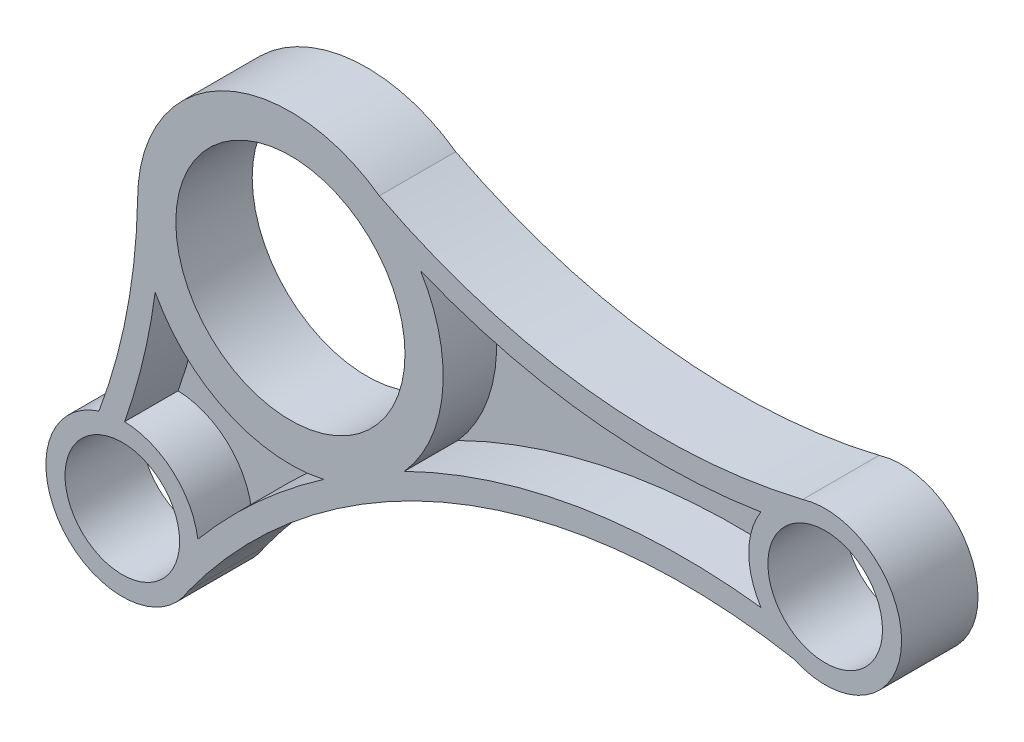
ISO-10303-21;
HEADER;
FILE_DESCRIPTION(('STEP AP214'),'2;1');
FILE_NAME('part.step','',(''),(''),'','','');
FILE_SCHEMA(('AUTOMOTIVE_DESIGN { 1 0 10303 214 1 1 1 1 }'));
ENDSEC;
DATA;
#1=APPLICATION_CONTEXT('core data for automotive mechanical design processes');
#2=APPLICATION_PROTOCOL_DEFINITION('international standard','automotive_design',2000,#1);
#3=PRODUCT_CONTEXT('',#1,'mechanical');
#4=PRODUCT('Part','Part','',(#3));
#5=PRODUCT_RELATED_PRODUCT_CATEGORY('part','',(#4));
#6=PRODUCT_DEFINITION_FORMATION('','',#4);
#7=PRODUCT_DEFINITION_CONTEXT('part definition',#1,'design');
#8=PRODUCT_DEFINITION('design','',#6,#7);
#9=PRODUCT_DEFINITION_SHAPE('','',#8);
#10=(LENGTH_UNIT() NAMED_UNIT(*) SI_UNIT(.MILLI.,.METRE.));
#11=(NAMED_UNIT(*) PLANE_ANGLE_UNIT() SI_UNIT($,.RADIAN.));
#12=(NAMED_UNIT(*) SI_UNIT($,.STERADIAN.) SOLID_ANGLE_UNIT());
#13=UNCERTAINTY_MEASURE_WITH_UNIT(LENGTH_MEASURE(1.E-05),#10,'distance_accuracy_value','');
#14=(GEOMETRIC_REPRESENTATION_CONTEXT(3) GLOBAL_UNCERTAINTY_ASSIGNED_CONTEXT((#13)) GLOBAL_UNIT_ASSIGNED_CONTEXT((#10,
#11,#12)) REPRESENTATION_CONTEXT('',''));
#15=CARTESIAN_POINT('',(0.,0.,0.));
#16=DIRECTION('',(0.,0.,1.));
#17=DIRECTION('',(1.,0.,0.));
#18=AXIS2_PLACEMENT_3D('',#15,#16,#17);
#19=CARTESIAN_POINT('',(158.484836341008,-30.8755712243687,10.));
#20=DIRECTION('',(0.,0.,-1.));
#21=DIRECTION('',(-1.,0.,0.));
#22=AXIS2_PLACEMENT_3D('',#19,#20,#21);
#23=CYLINDRICAL_SURFACE('',#22,83.);
#24=DIRECTION('',(0.,0.,-1.));
#25=VECTOR('',#24,1.);
#26=CARTESIAN_POINT('',(168.540603284391,51.5130296326696,10.));
#27=LINE('',#26,#25);
#28=CARTESIAN_POINT('',(168.540603284391,51.5130296326696,10.));
#29=VERTEX_POINT('',#28);
#30=CARTESIAN_POINT('',(168.540603284391,51.5130296326696,3.));
#31=VERTEX_POINT('',#30);
#32=EDGE_CURVE('E165',#29,#31,#27,.T.);
#33=ORIENTED_EDGE('',*,*,#32,.T.);
#34=CARTESIAN_POINT('',(158.484836341008,-30.8755712243687,3.));
#35=DIRECTION('',(0.,0.,-1.));
#36=DIRECTION('',(1.,0.,0.));
#37=AXIS2_PLACEMENT_3D('',#34,#35,#36);
#38=CIRCLE('',#37,83.);
#39=CARTESIAN_POINT('',(121.860601400403,43.6070805478085,3.));
#40=VERTEX_POINT('',#39);
#41=EDGE_CURVE('E57',#40,#31,#38,.T.);
#42=ORIENTED_EDGE('',*,*,#41,.F.);
#43=DIRECTION('',(0.,0.,-1.));
#44=VECTOR('',#43,1.);
#45=CARTESIAN_POINT('',(121.860601400403,43.6070805478085,10.));
#46=LINE('',#45,#44);
#47=CARTESIAN_POINT('',(121.860601400403,43.6070805478085,10.));
#48=VERTEX_POINT('',#47);
#49=EDGE_CURVE('E11',#48,#40,#46,.T.);
#50=ORIENTED_EDGE('',*,*,#49,.F.);
#51=CARTESIAN_POINT('',(158.484836341008,-30.8755712243687,10.));
#52=DIRECTION('',(0.,0.,1.));
#53=DIRECTION('',(1.,0.,0.));
#54=AXIS2_PLACEMENT_3D('',#51,#52,#53);
#55=CIRCLE('',#54,83.);
#56=EDGE_CURVE('E264',#29,#48,#55,.T.);
#57=ORIENTED_EDGE('',*,*,#56,.F.);
#58=EDGE_LOOP('',(#33,#42,#50,#57));
#59=FACE_BOUND('',#58,.T.);
#60=ADVANCED_FACE('F39',(#59),#23,.T.);
#61=CARTESIAN_POINT('',(106.94543276423,56.9314095948753,10.));
#62=DIRECTION('',(0.,0.,-1.));
#63=DIRECTION('',(-1.,0.,0.));
#64=AXIS2_PLACEMENT_3D('',#61,#62,#63);
#65=CYLINDRICAL_SURFACE('',#64,20.);
#66=ORIENTED_EDGE('',*,*,#49,.T.);
#67=CARTESIAN_POINT('',(106.94543276423,56.9314095948753,3.));
#68=DIRECTION('',(0.,0.,-1.));
#69=DIRECTION('',(1.,0.,0.));
#70=AXIS2_PLACEMENT_3D('',#67,#68,#69);
#71=CIRCLE('',#70,20.);
#72=CARTESIAN_POINT('',(123.981351448656,67.4088842227434,3.));
#73=VERTEX_POINT('',#72);
#74=EDGE_CURVE('E144',#73,#40,#71,.T.);
#75=ORIENTED_EDGE('',*,*,#74,.F.);
#76=DIRECTION('',(0.,0.,-1.));
#77=VECTOR('',#76,1.);
#78=CARTESIAN_POINT('',(123.981351448656,67.4088842227434,10.));
#79=LINE('',#78,#77);
#80=CARTESIAN_POINT('',(123.981351448656,67.4088842227434,10.));
#81=VERTEX_POINT('',#80);
#82=EDGE_CURVE('E49',#81,#73,#79,.T.);
#83=ORIENTED_EDGE('',*,*,#82,.F.);
#84=CARTESIAN_POINT('',(106.94543276423,56.9314095948753,10.));
#85=DIRECTION('',(0.,0.,1.));
#86=DIRECTION('',(1.,0.,0.));
#87=AXIS2_PLACEMENT_3D('',#84,#85,#86);
#88=CIRCLE('',#87,20.);
#89=EDGE_CURVE('E287',#48,#81,#88,.T.);
#90=ORIENTED_EDGE('',*,*,#89,.F.);
#91=EDGE_LOOP('',(#66,#75,#83,#90));
#92=FACE_BOUND('',#91,.T.);
#93=ADVANCED_FACE('F153',(#92),#65,.T.);
#94=CARTESIAN_POINT('',(155.302498185814,144.272307039252,10.));
#95=DIRECTION('',(0.,0.,-1.));
#96=DIRECTION('',(-1.,0.,0.));
#97=AXIS2_PLACEMENT_3D('',#94,#95,#96);
#98=CYLINDRICAL_SURFACE('',#97,83.);
#99=CARTESIAN_POINT('',(155.302498185814,144.272307039252,3.));
#100=DIRECTION('',(0.,0.,-1.));
#101=DIRECTION('',(1.,0.,0.));
#102=AXIS2_PLACEMENT_3D('',#99,#100,#101);
#103=CIRCLE('',#102,83.);
#104=CARTESIAN_POINT('',(168.529854033662,62.3330792098759,3.));
#105=VERTEX_POINT('',#104);
#106=EDGE_CURVE('E141',#105,#73,#103,.T.);
#107=ORIENTED_EDGE('',*,*,#106,.F.);
#108=DIRECTION('',(0.,0.,-1.));
#109=VECTOR('',#108,1.);
#110=CARTESIAN_POINT('',(168.529854033662,62.3330792098759,10.));
#111=LINE('',#110,#109);
#112=CARTESIAN_POINT('',(168.529854033662,62.3330792098759,10.));
#113=VERTEX_POINT('',#112);
#114=EDGE_CURVE('E162',#113,#105,#111,.T.);
#115=ORIENTED_EDGE('',*,*,#114,.F.);
#116=CARTESIAN_POINT('',(155.302498185814,144.272307039252,10.));
#117=DIRECTION('',(0.,0.,1.));
#118=DIRECTION('',(1.,0.,0.));
#119=AXIS2_PLACEMENT_3D('',#116,#117,#118);
#120=CIRCLE('',#119,83.);
#121=EDGE_CURVE('E160',#113,#81,#120,.F.);
#122=ORIENTED_EDGE('',*,*,#121,.T.);
#123=ORIENTED_EDGE('',*,*,#82,.T.);
#124=EDGE_LOOP('',(#107,#115,#122,#123));
#125=FACE_BOUND('',#124,.T.);
#126=ADVANCED_FACE('F158',(#125),#98,.T.);
#127=CARTESIAN_POINT('',(6.96072248214696,58.4954176163667,10.));
#128=DIRECTION('',(0.,0.,-1.));
#129=DIRECTION('',(-1.,0.,0.));
#130=AXIS2_PLACEMENT_3D('',#127,#128,#129);
#131=CYLINDRICAL_SURFACE('',#130,83.);
#132=CARTESIAN_POINT('',(6.96072248214696,58.4954176163667,3.));
#133=DIRECTION('',(0.,0.,-1.));
#134=DIRECTION('',(1.,0.,0.));
#135=AXIS2_PLACEMENT_3D('',#132,#133,#134);
#136=CIRCLE('',#135,83.);
#137=CARTESIAN_POINT('',(89.2451550237641,47.6201171007917,3.));
#138=VERTEX_POINT('',#137);
#139=CARTESIAN_POINT('',(85.2484753494684,30.9268167997636,3.));
#140=VERTEX_POINT('',#139);
#141=EDGE_CURVE('E65',#138,#140,#136,.T.);
#142=ORIENTED_EDGE('',*,*,#141,.F.);
#143=DIRECTION('',(0.,0.,-1.));
#144=VECTOR('',#143,1.);
#145=CARTESIAN_POINT('',(89.2451550237641,47.6201171007917,10.));
#146=LINE('',#145,#144);
#147=CARTESIAN_POINT('',(89.2451550237641,47.6201171007917,10.));
#148=VERTEX_POINT('',#147);
#149=EDGE_CURVE('E181',#148,#138,#146,.T.);
#150=ORIENTED_EDGE('',*,*,#149,.F.);
#151=CARTESIAN_POINT('',(6.96072248214696,58.4954176163667,10.));
#152=DIRECTION('',(0.,0.,1.));
#153=DIRECTION('',(1.,0.,0.));
#154=AXIS2_PLACEMENT_3D('',#151,#152,#153);
#155=CIRCLE('',#154,83.);
#156=CARTESIAN_POINT('',(85.2484753494684,30.9268167997636,10.));
#157=VERTEX_POINT('',#156);
#158=EDGE_CURVE('E302',#148,#157,#155,.F.);
#159=ORIENTED_EDGE('',*,*,#158,.T.);
#160=DIRECTION('',(0.,0.,-1.));
#161=VECTOR('',#160,1.);
#162=CARTESIAN_POINT('',(85.2484753494684,30.9268167997636,10.));
#163=LINE('',#162,#161);
#164=EDGE_CURVE('E169',#157,#140,#163,.T.);
#165=ORIENTED_EDGE('',*,*,#164,.T.);
#166=EDGE_LOOP('',(#142,#150,#159,#165));
#167=FACE_BOUND('',#166,.T.);
#168=ADVANCED_FACE('F362',(#167),#131,.T.);
#169=ORIENTED_EDGE('',*,*,#149,.T.);
#170=CARTESIAN_POINT('',(106.94543276423,56.9314095948753,3.));
#171=DIRECTION('',(0.,0.,-1.));
#172=DIRECTION('',(1.,0.,0.));
#173=AXIS2_PLACEMENT_3D('',#170,#171,#172);
#174=CIRCLE('',#173,20.);
#175=CARTESIAN_POINT('',(111.307748037173,37.41295152413,3.));
#176=VERTEX_POINT('',#175);
#177=EDGE_CURVE('E274',#176,#138,#174,.T.);
#178=ORIENTED_EDGE('',*,*,#177,.F.);
#179=DIRECTION('',(0.,0.,-1.));
#180=VECTOR('',#179,1.);
#181=CARTESIAN_POINT('',(111.307748037173,37.41295152413,10.));
#182=LINE('',#181,#180);
#183=CARTESIAN_POINT('',(111.307748037173,37.41295152413,10.));
#184=VERTEX_POINT('',#183);
#185=EDGE_CURVE('E177',#184,#176,#182,.T.);
#186=ORIENTED_EDGE('',*,*,#185,.F.);
#187=EDGE_CURVE('E288',#148,#184,#88,.T.);
#188=ORIENTED_EDGE('',*,*,#187,.F.);
#189=EDGE_LOOP('',(#169,#178,#186,#188));
#190=FACE_BOUND('',#189,.T.);
#191=ADVANCED_FACE('F350',(#190),#65,.T.);
#192=CARTESIAN_POINT('',(158.484836341008,-30.8755712243687,10.));
#193=DIRECTION('',(0.,0.,-1.));
#194=DIRECTION('',(-1.,0.,0.));
#195=AXIS2_PLACEMENT_3D('',#192,#193,#194);
#196=CYLINDRICAL_SURFACE('',#195,83.);
#197=ORIENTED_EDGE('',*,*,#185,.T.);
#198=CARTESIAN_POINT('',(158.484836341008,-30.8755712243687,3.));
#199=DIRECTION('',(0.,0.,-1.));
#200=DIRECTION('',(1.,0.,0.));
#201=AXIS2_PLACEMENT_3D('',#198,#199,#200);
#202=CIRCLE('',#201,83.);
#203=CARTESIAN_POINT('',(94.8374004670264,22.3973478496549,3.));
#204=VERTEX_POINT('',#203);
#205=EDGE_CURVE('E270',#204,#176,#202,.T.);
#206=ORIENTED_EDGE('',*,*,#205,.F.);
#207=DIRECTION('',(0.,0.,-1.));
#208=VECTOR('',#207,1.);
#209=CARTESIAN_POINT('',(94.8374004670264,22.3973478496549,10.));
#210=LINE('',#209,#208);
#211=CARTESIAN_POINT('',(94.8374004670264,22.3973478496549,10.));
#212=VERTEX_POINT('',#211);
#213=EDGE_CURVE('E173',#212,#204,#210,.T.);
#214=ORIENTED_EDGE('',*,*,#213,.F.);
#215=CARTESIAN_POINT('',(158.484836341008,-30.8755712243687,10.));
#216=DIRECTION('',(0.,0.,1.));
#217=DIRECTION('',(1.,0.,0.));
#218=AXIS2_PLACEMENT_3D('',#215,#216,#217);
#219=CIRCLE('',#218,83.);
#220=EDGE_CURVE('E306',#184,#212,#219,.T.);
#221=ORIENTED_EDGE('',*,*,#220,.F.);
#222=EDGE_LOOP('',(#197,#206,#214,#221));
#223=FACE_BOUND('',#222,.T.);
#224=ADVANCED_FACE('F358',(#223),#196,.T.);
#225=CARTESIAN_POINT('',(155.302498185814,144.272307039252,10.));
#226=DIRECTION('',(0.,0.,-1.));
#227=DIRECTION('',(-1.,0.,0.));
#228=AXIS2_PLACEMENT_3D('',#225,#226,#227);
#229=CYLINDRICAL_SURFACE('',#228,80.);
#230=CARTESIAN_POINT('',(155.302498185814,144.272307039252,0.));
#231=DIRECTION('',(0.,0.,1.));
#232=DIRECTION('',(1.,0.,0.));
#233=AXIS2_PLACEMENT_3D('',#230,#231,#232);
#234=CIRCLE('',#233,80.);
#235=CARTESIAN_POINT('',(174.00261283796,66.4885959424125,0.));
#236=VERTEX_POINT('',#235);
#237=CARTESIAN_POINT('',(118.581891774733,73.1977190010337,0.));
#238=VERTEX_POINT('',#237);
#239=EDGE_CURVE('E218',#236,#238,#234,.F.);
#240=ORIENTED_EDGE('',*,*,#239,.T.);
#241=DIRECTION('',(0.,0.,-1.));
#242=VECTOR('',#241,1.);
#243=CARTESIAN_POINT('',(118.581891774733,73.1977190010337,10.));
#244=LINE('',#243,#242);
#245=CARTESIAN_POINT('',(118.581891774733,73.1977190010337,10.));
#246=VERTEX_POINT('',#245);
#247=EDGE_CURVE('E43',#246,#238,#244,.T.);
#248=ORIENTED_EDGE('',*,*,#247,.F.);
#249=CARTESIAN_POINT('',(155.302498185814,144.272307039252,10.));
#250=DIRECTION('',(0.,0.,1.));
#251=DIRECTION('',(1.,0.,0.));
#252=AXIS2_PLACEMENT_3D('',#249,#250,#251);
#253=CIRCLE('',#252,80.);
#254=CARTESIAN_POINT('',(174.00261283796,66.4885959424125,10.));
#255=VERTEX_POINT('',#254);
#256=EDGE_CURVE('E257',#255,#246,#253,.F.);
#257=ORIENTED_EDGE('',*,*,#256,.F.);
#258=DIRECTION('',(0.,0.,-1.));
#259=VECTOR('',#258,1.);
#260=CARTESIAN_POINT('',(174.00261283796,66.4885959424125,10.));
#261=LINE('',#260,#259);
#262=EDGE_CURVE('E185',#255,#236,#261,.T.);
#263=ORIENTED_EDGE('',*,*,#262,.T.);
#264=EDGE_LOOP('',(#240,#248,#257,#263));
#265=FACE_BOUND('',#264,.T.);
#266=ADVANCED_FACE('F41',(#265),#229,.F.);
#267=CARTESIAN_POINT('',(106.94543276423,56.9314095948753,0.));
#268=DIRECTION('',(0.,0.,1.));
#269=DIRECTION('',(1.,0.,0.));
#270=AXIS2_PLACEMENT_3D('',#267,#268,#269);
#271=CIRCLE('',#270,20.);
#272=CARTESIAN_POINT('',(86.9454327642297,56.9314095948753,0.));
#273=VERTEX_POINT('',#272);
#274=EDGE_CURVE('E212',#238,#273,#271,.T.);
#275=ORIENTED_EDGE('',*,*,#274,.T.);
#276=DIRECTION('',(0.,0.,-1.));
#277=VECTOR('',#276,1.);
#278=CARTESIAN_POINT('',(86.9454327642297,56.9314095948753,10.));
#279=LINE('',#278,#277);
#280=CARTESIAN_POINT('',(86.9454327642297,56.9314095948753,10.));
#281=VERTEX_POINT('',#280);
#282=EDGE_CURVE('E199',#281,#273,#279,.T.);
#283=ORIENTED_EDGE('',*,*,#282,.F.);
#284=EDGE_CURVE('E213',#246,#281,#88,.T.);
#285=ORIENTED_EDGE('',*,*,#284,.F.);
#286=ORIENTED_EDGE('',*,*,#247,.T.);
#287=EDGE_LOOP('',(#275,#283,#285,#286));
#288=FACE_BOUND('',#287,.T.);
#289=ADVANCED_FACE('F211',(#288),#65,.T.);
#290=CARTESIAN_POINT('',(6.96072248214696,58.4954176163667,10.));
#291=DIRECTION('',(0.,0.,-1.));
#292=DIRECTION('',(-1.,0.,0.));
#293=AXIS2_PLACEMENT_3D('',#290,#291,#292);
#294=CYLINDRICAL_SURFACE('',#293,80.);
#295=CARTESIAN_POINT('',(6.96072248214696,58.4954176163667,0.));
#296=DIRECTION('',(0.,0.,1.));
#297=DIRECTION('',(1.,0.,0.));
#298=AXIS2_PLACEMENT_3D('',#295,#296,#297);
#299=CIRCLE('',#298,80.);
#300=CARTESIAN_POINT('',(81.8842119593921,30.4513322407811,0.));
#301=VERTEX_POINT('',#300);
#302=EDGE_CURVE('E227',#273,#301,#299,.F.);
#303=ORIENTED_EDGE('',*,*,#302,.T.);
#304=DIRECTION('',(0.,0.,-1.));
#305=VECTOR('',#304,1.);
#306=CARTESIAN_POINT('',(81.8842119593921,30.4513322407811,10.));
#307=LINE('',#306,#305);
#308=CARTESIAN_POINT('',(81.8842119593921,30.4513322407811,10.));
#309=VERTEX_POINT('',#308);
#310=EDGE_CURVE('E196',#309,#301,#307,.T.);
#311=ORIENTED_EDGE('',*,*,#310,.F.);
#312=CARTESIAN_POINT('',(6.96072248214696,58.4954176163667,10.));
#313=DIRECTION('',(0.,0.,1.));
#314=DIRECTION('',(1.,0.,0.));
#315=AXIS2_PLACEMENT_3D('',#312,#313,#314);
#316=CIRCLE('',#315,80.);
#317=EDGE_CURVE('E286',#281,#309,#316,.F.);
#318=ORIENTED_EDGE('',*,*,#317,.F.);
#319=ORIENTED_EDGE('',*,*,#282,.T.);
#320=EDGE_LOOP('',(#303,#311,#318,#319));
#321=FACE_BOUND('',#320,.T.);
#322=ADVANCED_FACE('F370',(#321),#294,.F.);
#323=CARTESIAN_POINT('',(84.9454327642297,20.9314095948753,10.));
#324=DIRECTION('',(0.,0.,-1.));
#325=DIRECTION('',(-1.,0.,0.));
#326=AXIS2_PLACEMENT_3D('',#323,#324,#325);
#327=CYLINDRICAL_SURFACE('',#326,9.99999999999999);
#328=CARTESIAN_POINT('',(84.9454327642297,20.9314095948753,0.));
#329=DIRECTION('',(0.,0.,1.));
#330=DIRECTION('',(1.,0.,0.));
#331=AXIS2_PLACEMENT_3D('',#328,#329,#330);
#332=CIRCLE('',#331,9.99999999999999);
#333=CARTESIAN_POINT('',(93.5995402638733,15.920778558308,0.));
#334=VERTEX_POINT('',#333);
#335=EDGE_CURVE('E235',#301,#334,#332,.T.);
#336=ORIENTED_EDGE('',*,*,#335,.T.);
#337=DIRECTION('',(0.,0.,-1.));
#338=VECTOR('',#337,1.);
#339=CARTESIAN_POINT('',(93.5995402638733,15.920778558308,10.));
#340=LINE('',#339,#338);
#341=CARTESIAN_POINT('',(93.5995402638733,15.920778558308,10.));
#342=VERTEX_POINT('',#341);
#343=EDGE_CURVE('E193',#342,#334,#340,.T.);
#344=ORIENTED_EDGE('',*,*,#343,.F.);
#345=CARTESIAN_POINT('',(84.9454327642297,20.9314095948753,10.));
#346=DIRECTION('',(0.,0.,1.));
#347=DIRECTION('',(1.,0.,0.));
#348=AXIS2_PLACEMENT_3D('',#345,#346,#347);
#349=CIRCLE('',#348,9.99999999999999);
#350=EDGE_CURVE('E291',#309,#342,#349,.T.);
#351=ORIENTED_EDGE('',*,*,#350,.F.);
#352=ORIENTED_EDGE('',*,*,#310,.T.);
#353=EDGE_LOOP('',(#336,#344,#351,#352));
#354=FACE_BOUND('',#353,.T.);
#355=ADVANCED_FACE('F357',(#354),#327,.T.);
#356=CARTESIAN_POINT('',(158.484836341008,-30.8755712243687,10.));
#357=DIRECTION('',(0.,0.,-1.));
#358=DIRECTION('',(-1.,0.,0.));
#359=AXIS2_PLACEMENT_3D('',#356,#357,#358);
#360=CYLINDRICAL_SURFACE('',#359,80.);
#361=CARTESIAN_POINT('',(158.484836341008,-30.8755712243687,0.));
#362=DIRECTION('',(0.,0.,1.));
#363=DIRECTION('',(1.,0.,0.));
#364=AXIS2_PLACEMENT_3D('',#361,#362,#363);
#365=CIRCLE('',#364,80.);
#366=CARTESIAN_POINT('',(172.792265806554,47.8346407057768,0.));
#367=VERTEX_POINT('',#366);
#368=EDGE_CURVE('E239',#367,#334,#365,.T.);
#369=ORIENTED_EDGE('',*,*,#368,.F.);
#370=DIRECTION('',(0.,0.,-1.));
#371=VECTOR('',#370,1.);
#372=CARTESIAN_POINT('',(172.792265806554,47.8346407057768,10.));
#373=LINE('',#372,#371);
#374=CARTESIAN_POINT('',(172.792265806554,47.8346407057768,10.));
#375=VERTEX_POINT('',#374);
#376=EDGE_CURVE('E189',#375,#367,#373,.T.);
#377=ORIENTED_EDGE('',*,*,#376,.F.);
#378=CARTESIAN_POINT('',(158.484836341008,-30.8755712243687,10.));
#379=DIRECTION('',(0.,0.,1.));
#380=DIRECTION('',(1.,0.,0.));
#381=AXIS2_PLACEMENT_3D('',#378,#379,#380);
#382=CIRCLE('',#381,80.);
#383=EDGE_CURVE('E294',#375,#342,#382,.T.);
#384=ORIENTED_EDGE('',*,*,#383,.T.);
#385=ORIENTED_EDGE('',*,*,#343,.T.);
#386=EDGE_LOOP('',(#369,#377,#384,#385));
#387=FACE_BOUND('',#386,.T.);
#388=ADVANCED_FACE('F366',(#387),#360,.F.);
#389=CARTESIAN_POINT('',(84.9454327642297,20.9314095948753,10.));
#390=DIRECTION('',(0.,0.,-1.));
#391=DIRECTION('',(-1.,0.,0.));
#392=AXIS2_PLACEMENT_3D('',#389,#390,#391);
#393=CYLINDRICAL_SURFACE('',#392,7.50000000000001);
#394=CARTESIAN_POINT('',(84.9454327642297,20.9314095948753,10.));
#395=DIRECTION('',(0.,0.,1.));
#396=DIRECTION('',(1.,0.,0.));
#397=AXIS2_PLACEMENT_3D('',#394,#395,#396);
#398=CIRCLE('',#397,7.50000000000001);
#399=CARTESIAN_POINT('',(92.4454327642297,20.9314095948753,10.));
#400=VERTEX_POINT('',#399);
#401=EDGE_CURVE('E317',#400,#400,#398,.T.);
#402=ORIENTED_EDGE('',*,*,#401,.T.);
#403=EDGE_LOOP('',(#402));
#404=FACE_BOUND('',#403,.T.);
#405=CARTESIAN_POINT('',(84.9454327642297,20.9314095948753,0.));
#406=DIRECTION('',(0.,0.,1.));
#407=DIRECTION('',(1.,0.,0.));
#408=AXIS2_PLACEMENT_3D('',#405,#406,#407);
#409=CIRCLE('',#408,7.50000000000001);
#410=CARTESIAN_POINT('',(92.4454327642297,20.9314095948753,0.));
#411=VERTEX_POINT('',#410);
#412=EDGE_CURVE('E250',#411,#411,#409,.T.);
#413=ORIENTED_EDGE('',*,*,#412,.F.);
#414=EDGE_LOOP('',(#413));
#415=FACE_BOUND('',#414,.T.);
#416=ADVANCED_FACE('F368',(#404,#415),#393,.F.);
#417=CARTESIAN_POINT('',(176.94543276423,56.9314095948753,10.));
#418=DIRECTION('',(0.,0.,-1.));
#419=DIRECTION('',(-1.,0.,0.));
#420=AXIS2_PLACEMENT_3D('',#417,#418,#419);
#421=CYLINDRICAL_SURFACE('',#420,7.50000000000001);
#422=CARTESIAN_POINT('',(176.94543276423,56.9314095948753,10.));
#423=DIRECTION('',(0.,0.,1.));
#424=DIRECTION('',(1.,0.,0.));
#425=AXIS2_PLACEMENT_3D('',#422,#423,#424);
#426=CIRCLE('',#425,7.50000000000001);
#427=CARTESIAN_POINT('',(184.44543276423,56.9314095948753,10.));
#428=VERTEX_POINT('',#427);
#429=EDGE_CURVE('E314',#428,#428,#426,.T.);
#430=ORIENTED_EDGE('',*,*,#429,.T.);
#431=EDGE_LOOP('',(#430));
#432=FACE_BOUND('',#431,.T.);
#433=CARTESIAN_POINT('',(176.94543276423,56.9314095948753,0.));
#434=DIRECTION('',(0.,0.,1.));
#435=DIRECTION('',(1.,0.,0.));
#436=AXIS2_PLACEMENT_3D('',#433,#434,#435);
#437=CIRCLE('',#436,7.50000000000001);
#438=CARTESIAN_POINT('',(184.44543276423,56.9314095948753,0.));
#439=VERTEX_POINT('',#438);
#440=EDGE_CURVE('E246',#439,#439,#437,.T.);
#441=ORIENTED_EDGE('',*,*,#440,.F.);
#442=EDGE_LOOP('',(#441));
#443=FACE_BOUND('',#442,.T.);
#444=ADVANCED_FACE('F392',(#432,#443),#421,.F.);
#445=CARTESIAN_POINT('',(176.94543276423,56.9314095948753,10.));
#446=DIRECTION('',(0.,0.,-1.));
#447=DIRECTION('',(-1.,0.,0.));
#448=AXIS2_PLACEMENT_3D('',#445,#446,#447);
#449=CYLINDRICAL_SURFACE('',#448,10.);
#450=ORIENTED_EDGE('',*,*,#114,.T.);
#451=CARTESIAN_POINT('',(176.94543276423,56.9314095948753,3.));
#452=DIRECTION('',(0.,0.,-1.));
#453=DIRECTION('',(1.,0.,0.));
#454=AXIS2_PLACEMENT_3D('',#451,#452,#453);
#455=CIRCLE('',#454,10.);
#456=EDGE_CURVE('E145',#31,#105,#455,.T.);
#457=ORIENTED_EDGE('',*,*,#456,.F.);
#458=ORIENTED_EDGE('',*,*,#32,.F.);
#459=CARTESIAN_POINT('',(176.94543276423,56.9314095948753,10.));
#460=DIRECTION('',(0.,0.,1.));
#461=DIRECTION('',(1.,0.,0.));
#462=AXIS2_PLACEMENT_3D('',#459,#460,#461);
#463=CIRCLE('',#462,10.);
#464=EDGE_CURVE('E268',#113,#29,#463,.T.);
#465=ORIENTED_EDGE('',*,*,#464,.F.);
#466=EDGE_LOOP('',(#450,#457,#458,#465));
#467=FACE_BOUND('',#466,.T.);
#468=ADVANCED_FACE('F267',(#467),#449,.T.);
#469=ORIENTED_EDGE('',*,*,#213,.T.);
#470=CARTESIAN_POINT('',(84.9454327642297,20.9314095948753,3.));
#471=DIRECTION('',(0.,0.,-1.));
#472=DIRECTION('',(1.,0.,0.));
#473=AXIS2_PLACEMENT_3D('',#470,#471,#472);
#474=CIRCLE('',#473,9.99999999999999);
#475=EDGE_CURVE('E223',#140,#204,#474,.T.);
#476=ORIENTED_EDGE('',*,*,#475,.F.);
#477=ORIENTED_EDGE('',*,*,#164,.F.);
#478=EDGE_CURVE('E295',#212,#157,#349,.T.);
#479=ORIENTED_EDGE('',*,*,#478,.F.);
#480=EDGE_LOOP('',(#469,#476,#477,#479));
#481=FACE_BOUND('',#480,.T.);
#482=ADVANCED_FACE('F353',(#481),#327,.T.);
#483=CARTESIAN_POINT('',(176.94543276423,56.9314095948753,0.));
#484=DIRECTION('',(0.,0.,1.));
#485=DIRECTION('',(1.,0.,0.));
#486=AXIS2_PLACEMENT_3D('',#483,#484,#485);
#487=CIRCLE('',#486,10.);
#488=EDGE_CURVE('E243',#367,#236,#487,.T.);
#489=ORIENTED_EDGE('',*,*,#488,.T.);
#490=ORIENTED_EDGE('',*,*,#262,.F.);
#491=EDGE_CURVE('E299',#375,#255,#463,.T.);
#492=ORIENTED_EDGE('',*,*,#491,.F.);
#493=ORIENTED_EDGE('',*,*,#376,.T.);
#494=EDGE_LOOP('',(#489,#490,#492,#493));
#495=FACE_BOUND('',#494,.T.);
#496=ADVANCED_FACE('F340',(#495),#449,.T.);
#497=CARTESIAN_POINT('',(106.94543276423,56.9314095948753,10.));
#498=DIRECTION('',(0.,0.,-1.));
#499=DIRECTION('',(-1.,0.,0.));
#500=AXIS2_PLACEMENT_3D('',#497,#498,#499);
#501=CYLINDRICAL_SURFACE('',#500,15.);
#502=CARTESIAN_POINT('',(106.94543276423,56.9314095948753,10.));
#503=DIRECTION('',(0.,0.,1.));
#504=DIRECTION('',(1.,0.,0.));
#505=AXIS2_PLACEMENT_3D('',#502,#503,#504);
#506=CIRCLE('',#505,15.);
#507=CARTESIAN_POINT('',(121.94543276423,56.9314095948753,10.));
#508=VERTEX_POINT('',#507);
#509=EDGE_CURVE('E190',#508,#508,#506,.T.);
#510=ORIENTED_EDGE('',*,*,#509,.T.);
#511=EDGE_LOOP('',(#510));
#512=FACE_BOUND('',#511,.T.);
#513=CARTESIAN_POINT('',(106.94543276423,56.9314095948753,0.));
#514=DIRECTION('',(0.,0.,1.));
#515=DIRECTION('',(1.,0.,0.));
#516=AXIS2_PLACEMENT_3D('',#513,#514,#515);
#517=CIRCLE('',#516,15.);
#518=CARTESIAN_POINT('',(121.94543276423,56.9314095948753,0.));
#519=VERTEX_POINT('',#518);
#520=EDGE_CURVE('E254',#519,#519,#517,.T.);
#521=ORIENTED_EDGE('',*,*,#520,.F.);
#522=EDGE_LOOP('',(#521));
#523=FACE_BOUND('',#522,.T.);
#524=ADVANCED_FACE('F326',(#512,#523),#501,.F.);
#525=CARTESIAN_POINT('',(0.,0.,10.));
#526=DIRECTION('',(0.,0.,1.));
#527=DIRECTION('',(1.,0.,0.));
#528=AXIS2_PLACEMENT_3D('',#525,#526,#527);
#529=PLANE('',#528);
#530=ORIENTED_EDGE('',*,*,#256,.T.);
#531=ORIENTED_EDGE('',*,*,#284,.T.);
#532=ORIENTED_EDGE('',*,*,#317,.T.);
#533=ORIENTED_EDGE('',*,*,#350,.T.);
#534=ORIENTED_EDGE('',*,*,#383,.F.);
#535=ORIENTED_EDGE('',*,*,#491,.T.);
#536=EDGE_LOOP('',(#530,#531,#532,#533,#534,#535));
#537=FACE_BOUND('',#536,.T.);
#538=ORIENTED_EDGE('',*,*,#158,.F.);
#539=ORIENTED_EDGE('',*,*,#187,.T.);
#540=ORIENTED_EDGE('',*,*,#220,.T.);
#541=ORIENTED_EDGE('',*,*,#478,.T.);
#542=EDGE_LOOP('',(#538,#539,#540,#541));
#543=FACE_BOUND('',#542,.T.);
#544=ORIENTED_EDGE('',*,*,#56,.T.);
#545=ORIENTED_EDGE('',*,*,#89,.T.);
#546=ORIENTED_EDGE('',*,*,#121,.F.);
#547=ORIENTED_EDGE('',*,*,#464,.T.);
#548=EDGE_LOOP('',(#544,#545,#546,#547));
#549=FACE_BOUND('',#548,.T.);
#550=ORIENTED_EDGE('',*,*,#429,.F.);
#551=EDGE_LOOP('',(#550));
#552=FACE_BOUND('',#551,.T.);
#553=ORIENTED_EDGE('',*,*,#401,.F.);
#554=EDGE_LOOP('',(#553));
#555=FACE_BOUND('',#554,.T.);
#556=ORIENTED_EDGE('',*,*,#509,.F.);
#557=EDGE_LOOP('',(#556));
#558=FACE_BOUND('',#557,.T.);
#559=ADVANCED_FACE('F329',(#537,#543,#549,#552,#555,#558),#529,.T.);
#560=CARTESIAN_POINT('',(0.,0.,0.));
#561=DIRECTION('',(0.,0.,1.));
#562=DIRECTION('',(1.,0.,0.));
#563=AXIS2_PLACEMENT_3D('',#560,#561,#562);
#564=PLANE('',#563);
#565=ORIENTED_EDGE('',*,*,#239,.F.);
#566=ORIENTED_EDGE('',*,*,#488,.F.);
#567=ORIENTED_EDGE('',*,*,#368,.T.);
#568=ORIENTED_EDGE('',*,*,#335,.F.);
#569=ORIENTED_EDGE('',*,*,#302,.F.);
#570=ORIENTED_EDGE('',*,*,#274,.F.);
#571=EDGE_LOOP('',(#565,#566,#567,#568,#569,#570));
#572=FACE_BOUND('',#571,.T.);
#573=ORIENTED_EDGE('',*,*,#440,.T.);
#574=EDGE_LOOP('',(#573));
#575=FACE_BOUND('',#574,.T.);
#576=ORIENTED_EDGE('',*,*,#412,.T.);
#577=EDGE_LOOP('',(#576));
#578=FACE_BOUND('',#577,.T.);
#579=ORIENTED_EDGE('',*,*,#520,.T.);
#580=EDGE_LOOP('',(#579));
#581=FACE_BOUND('',#580,.T.);
#582=ADVANCED_FACE('F331',(#572,#575,#578,#581),#564,.F.);
#583=CARTESIAN_POINT('',(121.715134552619,-4.97208081474667,3.));
#584=DIRECTION('',(0.,0.,1.));
#585=DIRECTION('',(1.,0.,0.));
#586=AXIS2_PLACEMENT_3D('',#583,#584,#585);
#587=PLANE('',#586);
#588=ORIENTED_EDGE('',*,*,#205,.T.);
#589=ORIENTED_EDGE('',*,*,#177,.T.);
#590=ORIENTED_EDGE('',*,*,#141,.T.);
#591=ORIENTED_EDGE('',*,*,#475,.T.);
#592=EDGE_LOOP('',(#588,#589,#590,#591));
#593=FACE_BOUND('',#592,.T.);
#594=ADVANCED_FACE('F338',(#593),#587,.T.);
#595=CARTESIAN_POINT('',(166.123965475022,100.601858317064,3.));
#596=DIRECTION('',(0.,0.,1.));
#597=DIRECTION('',(1.,0.,0.));
#598=AXIS2_PLACEMENT_3D('',#595,#596,#597);
#599=PLANE('',#598);
#600=ORIENTED_EDGE('',*,*,#106,.T.);
#601=ORIENTED_EDGE('',*,*,#74,.T.);
#602=ORIENTED_EDGE('',*,*,#41,.T.);
#603=ORIENTED_EDGE('',*,*,#456,.T.);
#604=EDGE_LOOP('',(#600,#601,#602,#603));
#605=FACE_BOUND('',#604,.T.);
#606=ADVANCED_FACE('F143',(#605),#599,.T.);
#607=CLOSED_SHELL('',(#60,#93,#126,#168,#191,#224,#266,#289,#322,#355,#388,#416,#444,#468,#482,
#496,#524,#559,#582,#594,#606));
#608=MANIFOLD_SOLID_BREP('B2',#607);
#609=ADVANCED_BREP_SHAPE_REPRESENTATION('',(#18,#608),#14);
#610=SHAPE_DEFINITION_REPRESENTATION(#9,#609);
ENDSEC;
END-ISO-10303-21;
